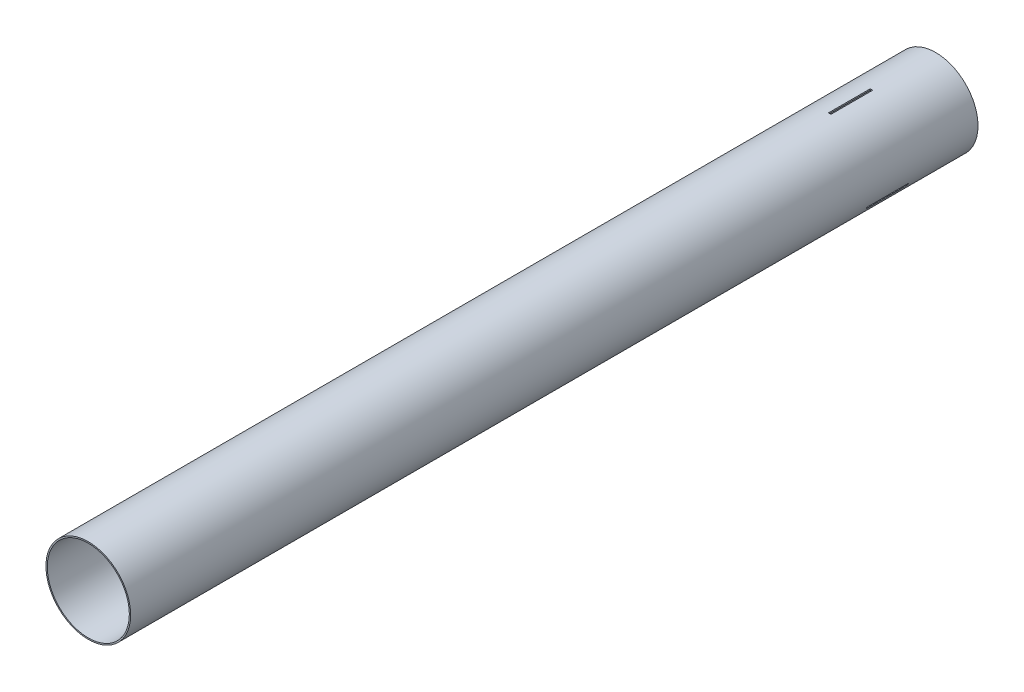
ISO-10303-21;
HEADER;
FILE_DESCRIPTION(('STEP AP214'),'2;1');
FILE_NAME('part.step','',(''),(''),'','','');
FILE_SCHEMA(('AUTOMOTIVE_DESIGN { 1 0 10303 214 1 1 1 1 }'));
ENDSEC;
DATA;
#1=APPLICATION_CONTEXT('core data for automotive mechanical design processes');
#2=APPLICATION_PROTOCOL_DEFINITION('international standard','automotive_design',2000,#1);
#3=PRODUCT_CONTEXT('',#1,'mechanical');
#4=PRODUCT('Part','Part','',(#3));
#5=PRODUCT_RELATED_PRODUCT_CATEGORY('part','',(#4));
#6=PRODUCT_DEFINITION_FORMATION('','',#4);
#7=PRODUCT_DEFINITION_CONTEXT('part definition',#1,'design');
#8=PRODUCT_DEFINITION('design','',#6,#7);
#9=PRODUCT_DEFINITION_SHAPE('','',#8);
#10=(LENGTH_UNIT() NAMED_UNIT(*) SI_UNIT(.MILLI.,.METRE.));
#11=(NAMED_UNIT(*) PLANE_ANGLE_UNIT() SI_UNIT($,.RADIAN.));
#12=(NAMED_UNIT(*) SI_UNIT($,.STERADIAN.) SOLID_ANGLE_UNIT());
#13=UNCERTAINTY_MEASURE_WITH_UNIT(LENGTH_MEASURE(1.E-05),#10,'distance_accuracy_value','');
#14=(GEOMETRIC_REPRESENTATION_CONTEXT(3) GLOBAL_UNCERTAINTY_ASSIGNED_CONTEXT((#13)) GLOBAL_UNIT_ASSIGNED_CONTEXT((#10,
#11,#12)) REPRESENTATION_CONTEXT('',''));
#15=CARTESIAN_POINT('',(0.,0.,0.));
#16=DIRECTION('',(0.,0.,1.));
#17=DIRECTION('',(1.,0.,0.));
#18=AXIS2_PLACEMENT_3D('',#15,#16,#17);
#19=CARTESIAN_POINT('',(0.,0.,1016.));
#20=DIRECTION('',(0.,0.,-1.));
#21=DIRECTION('',(-1.,0.,0.));
#22=AXIS2_PLACEMENT_3D('',#19,#20,#21);
#23=CYLINDRICAL_SURFACE('',#22,50.8);
#24=CARTESIAN_POINT('',(0.,0.,76.9874));
#25=DIRECTION('',(0.,0.,1.));
#26=DIRECTION('',(1.,0.,0.));
#27=AXIS2_PLACEMENT_3D('',#24,#25,#26);
#28=CIRCLE('',#27,50.8);
#29=CARTESIAN_POINT('',(43.2256434170204,-26.6867710895231,76.9874));
#30=VERTEX_POINT('',#29);
#31=CARTESIAN_POINT('',(44.7242434170202,-24.0911197493003,76.9874));
#32=VERTEX_POINT('',#31);
#33=EDGE_CURVE('E225',#30,#32,#28,.T.);
#34=ORIENTED_EDGE('',*,*,#33,.F.);
#35=DIRECTION('',(0.,0.,-1.));
#36=VECTOR('',#35,1.);
#37=CARTESIAN_POINT('',(43.2256434170204,-26.6867710895231,1016.));
#38=LINE('',#37,#36);
#39=CARTESIAN_POINT('',(43.2256434170204,-26.6867710895231,127.));
#40=VERTEX_POINT('',#39);
#41=EDGE_CURVE('E227',#30,#40,#38,.F.);
#42=ORIENTED_EDGE('',*,*,#41,.T.);
#43=CARTESIAN_POINT('',(0.,0.,127.));
#44=DIRECTION('',(0.,0.,1.));
#45=DIRECTION('',(1.,0.,0.));
#46=AXIS2_PLACEMENT_3D('',#43,#44,#45);
#47=CIRCLE('',#46,50.8);
#48=CARTESIAN_POINT('',(44.7242434170202,-24.0911197493003,127.));
#49=VERTEX_POINT('',#48);
#50=EDGE_CURVE('E222',#40,#49,#47,.T.);
#51=ORIENTED_EDGE('',*,*,#50,.T.);
#52=DIRECTION('',(0.,0.,-1.));
#53=VECTOR('',#52,1.);
#54=CARTESIAN_POINT('',(44.7242434170202,-24.0911197493003,1016.));
#55=LINE('',#54,#53);
#56=EDGE_CURVE('E230',#49,#32,#55,.T.);
#57=ORIENTED_EDGE('',*,*,#56,.T.);
#58=EDGE_LOOP('',(#34,#42,#51,#57));
#59=FACE_BOUND('',#58,.T.);
#60=CARTESIAN_POINT('',(0.,0.,0.));
#61=DIRECTION('',(0.,0.,1.));
#62=DIRECTION('',(1.,0.,0.));
#63=AXIS2_PLACEMENT_3D('',#60,#61,#62);
#64=CIRCLE('',#63,50.8);
#65=CARTESIAN_POINT('',(50.8,0.,0.));
#66=VERTEX_POINT('',#65);
#67=EDGE_CURVE('E244',#66,#66,#64,.T.);
#68=ORIENTED_EDGE('',*,*,#67,.T.);
#69=EDGE_LOOP('',(#68));
#70=FACE_BOUND('',#69,.T.);
#71=CARTESIAN_POINT('',(0.,0.,1016.));
#72=DIRECTION('',(0.,0.,1.));
#73=DIRECTION('',(1.,0.,0.));
#74=AXIS2_PLACEMENT_3D('',#71,#72,#73);
#75=CIRCLE('',#74,50.8);
#76=CARTESIAN_POINT('',(50.8,0.,1016.));
#77=VERTEX_POINT('',#76);
#78=EDGE_CURVE('E137',#77,#77,#75,.T.);
#79=ORIENTED_EDGE('',*,*,#78,.F.);
#80=EDGE_LOOP('',(#79));
#81=FACE_BOUND('',#80,.T.);
#82=CARTESIAN_POINT('',(0.,0.,76.9874));
#83=DIRECTION('',(0.,0.,1.));
#84=DIRECTION('',(1.,0.,0.));
#85=AXIS2_PLACEMENT_3D('',#82,#83,#84);
#86=CIRCLE('',#85,50.8);
#87=CARTESIAN_POINT('',(-44.8901667970468,-23.7805156574308,76.9874));
#88=VERTEX_POINT('',#87);
#89=CARTESIAN_POINT('',(-43.4095582596504,-26.3865543734308,76.9874));
#90=VERTEX_POINT('',#89);
#91=EDGE_CURVE('E196',#88,#90,#86,.T.);
#92=ORIENTED_EDGE('',*,*,#91,.F.);
#93=DIRECTION('',(0.,0.,-1.));
#94=VECTOR('',#93,1.);
#95=CARTESIAN_POINT('',(-44.8901667970468,-23.7805156574308,1016.));
#96=LINE('',#95,#94);
#97=CARTESIAN_POINT('',(-44.8901667970468,-23.7805156574308,127.));
#98=VERTEX_POINT('',#97);
#99=EDGE_CURVE('E218',#88,#98,#96,.F.);
#100=ORIENTED_EDGE('',*,*,#99,.T.);
#101=CARTESIAN_POINT('',(0.,0.,127.));
#102=DIRECTION('',(0.,0.,1.));
#103=DIRECTION('',(1.,0.,0.));
#104=AXIS2_PLACEMENT_3D('',#101,#102,#103);
#105=CIRCLE('',#104,50.8);
#106=CARTESIAN_POINT('',(-43.4095582596504,-26.3865543734308,127.));
#107=VERTEX_POINT('',#106);
#108=EDGE_CURVE('E194',#98,#107,#105,.T.);
#109=ORIENTED_EDGE('',*,*,#108,.T.);
#110=DIRECTION('',(0.,0.,-1.));
#111=VECTOR('',#110,1.);
#112=CARTESIAN_POINT('',(-43.4095582596504,-26.3865543734308,1016.));
#113=LINE('',#112,#111);
#114=EDGE_CURVE('E145',#107,#90,#113,.T.);
#115=ORIENTED_EDGE('',*,*,#114,.T.);
#116=EDGE_LOOP('',(#92,#100,#109,#115));
#117=FACE_BOUND('',#116,.T.);
#118=CARTESIAN_POINT('',(0.,0.,76.9874));
#119=DIRECTION('',(0.,0.,1.));
#120=DIRECTION('',(1.,0.,0.));
#121=AXIS2_PLACEMENT_3D('',#118,#119,#120);
#122=CIRCLE('',#121,50.8);
#123=CARTESIAN_POINT('',(1.4986,50.7778908388287,76.9874));
#124=VERTEX_POINT('',#123);
#125=CARTESIAN_POINT('',(-1.4986,50.7778908388287,76.9874));
#126=VERTEX_POINT('',#125);
#127=EDGE_CURVE('E184',#124,#126,#122,.T.);
#128=ORIENTED_EDGE('',*,*,#127,.F.);
#129=DIRECTION('',(0.,0.,-1.));
#130=VECTOR('',#129,1.);
#131=CARTESIAN_POINT('',(1.4986,50.7778908388287,1016.));
#132=LINE('',#131,#130);
#133=CARTESIAN_POINT('',(1.4986,50.7778908388287,127.));
#134=VERTEX_POINT('',#133);
#135=EDGE_CURVE('E193',#124,#134,#132,.F.);
#136=ORIENTED_EDGE('',*,*,#135,.T.);
#137=CARTESIAN_POINT('',(0.,0.,127.));
#138=DIRECTION('',(0.,0.,1.));
#139=DIRECTION('',(1.,0.,0.));
#140=AXIS2_PLACEMENT_3D('',#137,#138,#139);
#141=CIRCLE('',#140,50.8);
#142=CARTESIAN_POINT('',(-1.4986,50.7778908388287,127.));
#143=VERTEX_POINT('',#142);
#144=EDGE_CURVE('E233',#134,#143,#141,.T.);
#145=ORIENTED_EDGE('',*,*,#144,.T.);
#146=DIRECTION('',(0.,0.,-1.));
#147=VECTOR('',#146,1.);
#148=CARTESIAN_POINT('',(-1.4986,50.7778908388287,1016.));
#149=LINE('',#148,#147);
#150=EDGE_CURVE('E238',#143,#126,#149,.T.);
#151=ORIENTED_EDGE('',*,*,#150,.T.);
#152=EDGE_LOOP('',(#128,#136,#145,#151));
#153=FACE_BOUND('',#152,.T.);
#154=ADVANCED_FACE('F38',(#59,#70,#81,#117,#153),#23,.T.);
#155=CARTESIAN_POINT('',(0.,0.,1016.));
#156=DIRECTION('',(0.,0.,-1.));
#157=DIRECTION('',(-1.,0.,0.));
#158=AXIS2_PLACEMENT_3D('',#155,#156,#157);
#159=CYLINDRICAL_SURFACE('',#158,49.2125);
#160=CARTESIAN_POINT('',(0.,0.,1016.));
#161=DIRECTION('',(0.,0.,1.));
#162=DIRECTION('',(1.,0.,0.));
#163=AXIS2_PLACEMENT_3D('',#160,#161,#162);
#164=CIRCLE('',#163,49.2125);
#165=CARTESIAN_POINT('',(49.2125,0.,1016.));
#166=VERTEX_POINT('',#165);
#167=EDGE_CURVE('E241',#166,#166,#164,.T.);
#168=ORIENTED_EDGE('',*,*,#167,.T.);
#169=EDGE_LOOP('',(#168));
#170=FACE_BOUND('',#169,.T.);
#171=CARTESIAN_POINT('',(0.,0.,0.));
#172=DIRECTION('',(0.,0.,1.));
#173=DIRECTION('',(1.,0.,0.));
#174=AXIS2_PLACEMENT_3D('',#171,#172,#173);
#175=CIRCLE('',#174,49.2125);
#176=CARTESIAN_POINT('',(49.2125,0.,0.));
#177=VERTEX_POINT('',#176);
#178=EDGE_CURVE('E240',#177,#177,#175,.T.);
#179=ORIENTED_EDGE('',*,*,#178,.F.);
#180=EDGE_LOOP('',(#179));
#181=FACE_BOUND('',#180,.T.);
#182=DIRECTION('',(0.,0.,-1.));
#183=VECTOR('',#182,1.);
#184=CARTESIAN_POINT('',(-43.5144088743328,-22.9862214504121,1016.));
#185=LINE('',#184,#183);
#186=CARTESIAN_POINT('',(-43.5144088743328,-22.9862214504121,76.9874));
#187=VERTEX_POINT('',#186);
#188=CARTESIAN_POINT('',(-43.5144088743328,-22.9862214504121,127.));
#189=VERTEX_POINT('',#188);
#190=EDGE_CURVE('E136',#187,#189,#185,.F.);
#191=ORIENTED_EDGE('',*,*,#190,.F.);
#192=CARTESIAN_POINT('',(0.,0.,76.9874));
#193=DIRECTION('',(0.,0.,1.));
#194=DIRECTION('',(1.,0.,0.));
#195=AXIS2_PLACEMENT_3D('',#192,#193,#194);
#196=CIRCLE('',#195,49.2125);
#197=CARTESIAN_POINT('',(-42.0343812662779,-25.5925955661239,76.9874));
#198=VERTEX_POINT('',#197);
#199=EDGE_CURVE('E151',#187,#198,#196,.T.);
#200=ORIENTED_EDGE('',*,*,#199,.T.);
#201=DIRECTION('',(0.,0.,-1.));
#202=VECTOR('',#201,1.);
#203=CARTESIAN_POINT('',(-42.0343812662779,-25.5925955661239,1016.));
#204=LINE('',#203,#202);
#205=CARTESIAN_POINT('',(-42.0343812662779,-25.5925955661239,127.));
#206=VERTEX_POINT('',#205);
#207=EDGE_CURVE('E142',#206,#198,#204,.T.);
#208=ORIENTED_EDGE('',*,*,#207,.F.);
#209=CARTESIAN_POINT('',(0.,0.,127.));
#210=DIRECTION('',(0.,0.,1.));
#211=DIRECTION('',(1.,0.,0.));
#212=AXIS2_PLACEMENT_3D('',#209,#210,#211);
#213=CIRCLE('',#212,49.2125);
#214=EDGE_CURVE('E125',#189,#206,#213,.T.);
#215=ORIENTED_EDGE('',*,*,#214,.F.);
#216=EDGE_LOOP('',(#191,#200,#208,#215));
#217=FACE_BOUND('',#216,.T.);
#218=DIRECTION('',(0.,0.,-1.));
#219=VECTOR('',#218,1.);
#220=CARTESIAN_POINT('',(41.8502101581889,-25.8926643272844,1016.));
#221=LINE('',#220,#219);
#222=CARTESIAN_POINT('',(41.8502101581889,-25.8926643272844,76.9874));
#223=VERTEX_POINT('',#222);
#224=CARTESIAN_POINT('',(41.8502101581889,-25.8926643272844,127.));
#225=VERTEX_POINT('',#224);
#226=EDGE_CURVE('E158',#223,#225,#221,.F.);
#227=ORIENTED_EDGE('',*,*,#226,.F.);
#228=CARTESIAN_POINT('',(0.,0.,76.9874));
#229=DIRECTION('',(0.,0.,1.));
#230=DIRECTION('',(1.,0.,0.));
#231=AXIS2_PLACEMENT_3D('',#228,#229,#230);
#232=CIRCLE('',#231,49.2125);
#233=CARTESIAN_POINT('',(43.3488101581887,-23.2970129870615,76.9874));
#234=VERTEX_POINT('',#233);
#235=EDGE_CURVE('E163',#223,#234,#232,.T.);
#236=ORIENTED_EDGE('',*,*,#235,.T.);
#237=DIRECTION('',(0.,0.,-1.));
#238=VECTOR('',#237,1.);
#239=CARTESIAN_POINT('',(43.3488101581887,-23.2970129870615,1016.));
#240=LINE('',#239,#238);
#241=CARTESIAN_POINT('',(43.3488101581887,-23.2970129870615,127.));
#242=VERTEX_POINT('',#241);
#243=EDGE_CURVE('E161',#242,#234,#240,.T.);
#244=ORIENTED_EDGE('',*,*,#243,.F.);
#245=CARTESIAN_POINT('',(0.,0.,127.));
#246=DIRECTION('',(0.,0.,1.));
#247=DIRECTION('',(1.,0.,0.));
#248=AXIS2_PLACEMENT_3D('',#245,#246,#247);
#249=CIRCLE('',#248,49.2125);
#250=EDGE_CURVE('E153',#225,#242,#249,.T.);
#251=ORIENTED_EDGE('',*,*,#250,.F.);
#252=EDGE_LOOP('',(#227,#236,#244,#251));
#253=FACE_BOUND('',#252,.T.);
#254=DIRECTION('',(0.,0.,-1.));
#255=VECTOR('',#254,1.);
#256=CARTESIAN_POINT('',(1.4986,49.1896773143512,1016.));
#257=LINE('',#256,#255);
#258=CARTESIAN_POINT('',(1.4986,49.1896773143512,76.9874));
#259=VERTEX_POINT('',#258);
#260=CARTESIAN_POINT('',(1.4986,49.1896773143512,127.));
#261=VERTEX_POINT('',#260);
#262=EDGE_CURVE('E168',#259,#261,#257,.F.);
#263=ORIENTED_EDGE('',*,*,#262,.F.);
#264=CARTESIAN_POINT('',(0.,0.,76.9874));
#265=DIRECTION('',(0.,0.,1.));
#266=DIRECTION('',(1.,0.,0.));
#267=AXIS2_PLACEMENT_3D('',#264,#265,#266);
#268=CIRCLE('',#267,49.2125);
#269=CARTESIAN_POINT('',(-1.4986,49.1896773143512,76.9874));
#270=VERTEX_POINT('',#269);
#271=EDGE_CURVE('E11',#259,#270,#268,.T.);
#272=ORIENTED_EDGE('',*,*,#271,.T.);
#273=DIRECTION('',(0.,0.,-1.));
#274=VECTOR('',#273,1.);
#275=CARTESIAN_POINT('',(-1.4986,49.1896773143512,1016.));
#276=LINE('',#275,#274);
#277=CARTESIAN_POINT('',(-1.4986,49.1896773143512,127.));
#278=VERTEX_POINT('',#277);
#279=EDGE_CURVE('E45',#278,#270,#276,.T.);
#280=ORIENTED_EDGE('',*,*,#279,.F.);
#281=CARTESIAN_POINT('',(0.,0.,127.));
#282=DIRECTION('',(0.,0.,1.));
#283=DIRECTION('',(1.,0.,0.));
#284=AXIS2_PLACEMENT_3D('',#281,#282,#283);
#285=CIRCLE('',#284,49.2125);
#286=EDGE_CURVE('E166',#261,#278,#285,.T.);
#287=ORIENTED_EDGE('',*,*,#286,.F.);
#288=EDGE_LOOP('',(#263,#272,#280,#287));
#289=FACE_BOUND('',#288,.T.);
#290=ADVANCED_FACE('F149',(#170,#181,#217,#253,#289),#159,.F.);
#291=CARTESIAN_POINT('',(0.,0.,1016.));
#292=DIRECTION('',(0.,0.,1.));
#293=DIRECTION('',(1.,0.,0.));
#294=AXIS2_PLACEMENT_3D('',#291,#292,#293);
#295=PLANE('',#294);
#296=ORIENTED_EDGE('',*,*,#78,.T.);
#297=EDGE_LOOP('',(#296));
#298=FACE_BOUND('',#297,.T.);
#299=ORIENTED_EDGE('',*,*,#167,.F.);
#300=EDGE_LOOP('',(#299));
#301=FACE_BOUND('',#300,.T.);
#302=ADVANCED_FACE('F257',(#298,#301),#295,.T.);
#303=CARTESIAN_POINT('',(0.,0.,0.));
#304=DIRECTION('',(0.,0.,1.));
#305=DIRECTION('',(1.,0.,0.));
#306=AXIS2_PLACEMENT_3D('',#303,#304,#305);
#307=PLANE('',#306);
#308=ORIENTED_EDGE('',*,*,#67,.F.);
#309=EDGE_LOOP('',(#308));
#310=FACE_BOUND('',#309,.T.);
#311=ORIENTED_EDGE('',*,*,#178,.T.);
#312=EDGE_LOOP('',(#311));
#313=FACE_BOUND('',#312,.T.);
#314=ADVANCED_FACE('F254',(#310,#313),#307,.F.);
#315=CARTESIAN_POINT('',(-25.3721912416451,-15.9726756701134,76.9874));
#316=DIRECTION('',(0.5,-0.866025403784439,0.));
#317=DIRECTION('',(0.866025403784439,0.5,0.));
#318=AXIS2_PLACEMENT_3D('',#315,#316,#317);
#319=PLANE('',#318);
#320=DIRECTION('',(0.866025403784438,0.5,0.));
#321=VECTOR('',#320,1.);
#322=CARTESIAN_POINT('',(-25.3721912416451,-15.9726756701134,127.));
#323=LINE('',#322,#321);
#324=EDGE_CURVE('E128',#107,#206,#323,.T.);
#325=ORIENTED_EDGE('',*,*,#324,.T.);
#326=ORIENTED_EDGE('',*,*,#207,.T.);
#327=DIRECTION('',(0.866025403784438,0.5,0.));
#328=VECTOR('',#327,1.);
#329=CARTESIAN_POINT('',(-25.3721912416451,-15.9726756701134,76.9874));
#330=LINE('',#329,#328);
#331=EDGE_CURVE('E212',#90,#198,#330,.T.);
#332=ORIENTED_EDGE('',*,*,#331,.F.);
#333=ORIENTED_EDGE('',*,*,#114,.F.);
#334=EDGE_LOOP('',(#325,#326,#332,#333));
#335=FACE_BOUND('',#334,.T.);
#336=ADVANCED_FACE('F140',(#335),#319,.F.);
#337=CARTESIAN_POINT('',(-26.8707912416451,-13.3770243298907,76.9874));
#338=DIRECTION('',(-0.5,0.866025403784439,0.));
#339=DIRECTION('',(-0.866025403784439,-0.5,0.));
#340=AXIS2_PLACEMENT_3D('',#337,#338,#339);
#341=PLANE('',#340);
#342=DIRECTION('',(-0.866025403784438,-0.5,0.));
#343=VECTOR('',#342,1.);
#344=CARTESIAN_POINT('',(-26.8707912416451,-13.3770243298907,76.9874));
#345=LINE('',#344,#343);
#346=EDGE_CURVE('E209',#187,#88,#345,.T.);
#347=ORIENTED_EDGE('',*,*,#346,.F.);
#348=ORIENTED_EDGE('',*,*,#190,.T.);
#349=DIRECTION('',(-0.866025403784438,-0.5,0.));
#350=VECTOR('',#349,1.);
#351=CARTESIAN_POINT('',(-26.8707912416451,-13.3770243298907,127.));
#352=LINE('',#351,#350);
#353=EDGE_CURVE('E131',#189,#98,#352,.T.);
#354=ORIENTED_EDGE('',*,*,#353,.T.);
#355=ORIENTED_EDGE('',*,*,#99,.F.);
#356=EDGE_LOOP('',(#347,#348,#354,#355));
#357=FACE_BOUND('',#356,.T.);
#358=ADVANCED_FACE('F273',(#357),#341,.F.);
#359=CARTESIAN_POINT('',(0.,0.,76.9874));
#360=DIRECTION('',(0.,0.,1.));
#361=DIRECTION('',(1.,0.,0.));
#362=AXIS2_PLACEMENT_3D('',#359,#360,#361);
#363=PLANE('',#362);
#364=ORIENTED_EDGE('',*,*,#91,.T.);
#365=ORIENTED_EDGE('',*,*,#331,.T.);
#366=ORIENTED_EDGE('',*,*,#199,.F.);
#367=ORIENTED_EDGE('',*,*,#346,.T.);
#368=EDGE_LOOP('',(#364,#365,#366,#367));
#369=FACE_BOUND('',#368,.T.);
#370=ADVANCED_FACE('F276',(#369),#363,.T.);
#371=CARTESIAN_POINT('',(0.,0.,127.));
#372=DIRECTION('',(0.,0.,1.));
#373=DIRECTION('',(1.,0.,0.));
#374=AXIS2_PLACEMENT_3D('',#371,#372,#373);
#375=PLANE('',#374);
#376=ORIENTED_EDGE('',*,*,#353,.F.);
#377=ORIENTED_EDGE('',*,*,#214,.T.);
#378=ORIENTED_EDGE('',*,*,#324,.F.);
#379=ORIENTED_EDGE('',*,*,#108,.F.);
#380=EDGE_LOOP('',(#376,#377,#378,#379));
#381=FACE_BOUND('',#380,.T.);
#382=ADVANCED_FACE('F127',(#381),#375,.F.);
#383=CARTESIAN_POINT('',(26.5188385175534,-13.580224329887,76.9874));
#384=DIRECTION('',(0.5,0.866025403784439,0.));
#385=DIRECTION('',(-0.866025403784439,0.5,0.));
#386=AXIS2_PLACEMENT_3D('',#383,#384,#385);
#387=PLANE('',#386);
#388=DIRECTION('',(-0.866025403784439,0.5,0.));
#389=VECTOR('',#388,1.);
#390=CARTESIAN_POINT('',(26.5188385175534,-13.580224329887,127.));
#391=LINE('',#390,#389);
#392=EDGE_CURVE('E60',#49,#242,#391,.T.);
#393=ORIENTED_EDGE('',*,*,#392,.T.);
#394=ORIENTED_EDGE('',*,*,#243,.T.);
#395=DIRECTION('',(-0.866025403784439,0.5,0.));
#396=VECTOR('',#395,1.);
#397=CARTESIAN_POINT('',(26.5188385175534,-13.580224329887,76.9874));
#398=LINE('',#397,#396);
#399=EDGE_CURVE('E202',#32,#234,#398,.T.);
#400=ORIENTED_EDGE('',*,*,#399,.F.);
#401=ORIENTED_EDGE('',*,*,#56,.F.);
#402=EDGE_LOOP('',(#393,#394,#400,#401));
#403=FACE_BOUND('',#402,.T.);
#404=ADVANCED_FACE('F280',(#403),#387,.F.);
#405=CARTESIAN_POINT('',(25.0202385175534,-16.1758756701097,76.9874));
#406=DIRECTION('',(-0.5,-0.866025403784439,0.));
#407=DIRECTION('',(0.866025403784439,-0.5,0.));
#408=AXIS2_PLACEMENT_3D('',#405,#406,#407);
#409=PLANE('',#408);
#410=DIRECTION('',(0.866025403784439,-0.5,0.));
#411=VECTOR('',#410,1.);
#412=CARTESIAN_POINT('',(25.0202385175534,-16.1758756701097,76.9874));
#413=LINE('',#412,#411);
#414=EDGE_CURVE('E200',#223,#30,#413,.T.);
#415=ORIENTED_EDGE('',*,*,#414,.F.);
#416=ORIENTED_EDGE('',*,*,#226,.T.);
#417=DIRECTION('',(0.866025403784439,-0.5,0.));
#418=VECTOR('',#417,1.);
#419=CARTESIAN_POINT('',(25.0202385175534,-16.1758756701097,127.));
#420=LINE('',#419,#418);
#421=EDGE_CURVE('E205',#225,#40,#420,.T.);
#422=ORIENTED_EDGE('',*,*,#421,.T.);
#423=ORIENTED_EDGE('',*,*,#41,.F.);
#424=EDGE_LOOP('',(#415,#416,#422,#423));
#425=FACE_BOUND('',#424,.T.);
#426=ADVANCED_FACE('F286',(#425),#409,.F.);
#427=CARTESIAN_POINT('',(0.,0.,76.9874));
#428=DIRECTION('',(0.,0.,1.));
#429=DIRECTION('',(1.,0.,0.));
#430=AXIS2_PLACEMENT_3D('',#427,#428,#429);
#431=PLANE('',#430);
#432=ORIENTED_EDGE('',*,*,#33,.T.);
#433=ORIENTED_EDGE('',*,*,#399,.T.);
#434=ORIENTED_EDGE('',*,*,#235,.F.);
#435=ORIENTED_EDGE('',*,*,#414,.T.);
#436=EDGE_LOOP('',(#432,#433,#434,#435));
#437=FACE_BOUND('',#436,.T.);
#438=ADVANCED_FACE('F290',(#437),#431,.T.);
#439=CARTESIAN_POINT('',(0.,0.,127.));
#440=DIRECTION('',(0.,0.,1.));
#441=DIRECTION('',(1.,0.,0.));
#442=AXIS2_PLACEMENT_3D('',#439,#440,#441);
#443=PLANE('',#442);
#444=ORIENTED_EDGE('',*,*,#421,.F.);
#445=ORIENTED_EDGE('',*,*,#250,.T.);
#446=ORIENTED_EDGE('',*,*,#392,.F.);
#447=ORIENTED_EDGE('',*,*,#50,.F.);
#448=EDGE_LOOP('',(#444,#445,#446,#447));
#449=FACE_BOUND('',#448,.T.);
#450=ADVANCED_FACE('F292',(#449),#443,.F.);
#451=CARTESIAN_POINT('',(-1.4986,30.1625,76.9874));
#452=DIRECTION('',(-1.,0.,0.));
#453=DIRECTION('',(0.,0.,1.));
#454=AXIS2_PLACEMENT_3D('',#451,#452,#453);
#455=PLANE('',#454);
#456=DIRECTION('',(0.,-1.,0.));
#457=VECTOR('',#456,1.);
#458=CARTESIAN_POINT('',(-1.4986,30.1625,127.));
#459=LINE('',#458,#457);
#460=EDGE_CURVE('E52',#143,#278,#459,.T.);
#461=ORIENTED_EDGE('',*,*,#460,.T.);
#462=ORIENTED_EDGE('',*,*,#279,.T.);
#463=DIRECTION('',(0.,-1.,0.));
#464=VECTOR('',#463,1.);
#465=CARTESIAN_POINT('',(-1.4986,30.1625,76.9874));
#466=LINE('',#465,#464);
#467=EDGE_CURVE('E175',#126,#270,#466,.T.);
#468=ORIENTED_EDGE('',*,*,#467,.F.);
#469=ORIENTED_EDGE('',*,*,#150,.F.);
#470=EDGE_LOOP('',(#461,#462,#468,#469));
#471=FACE_BOUND('',#470,.T.);
#472=ADVANCED_FACE('F174',(#471),#455,.F.);
#473=CARTESIAN_POINT('',(1.4986,30.1625,76.9874));
#474=DIRECTION('',(1.,0.,0.));
#475=DIRECTION('',(0.,0.,-1.));
#476=AXIS2_PLACEMENT_3D('',#473,#474,#475);
#477=PLANE('',#476);
#478=DIRECTION('',(0.,1.,0.));
#479=VECTOR('',#478,1.);
#480=CARTESIAN_POINT('',(1.4986,30.1625,76.9874));
#481=LINE('',#480,#479);
#482=EDGE_CURVE('E185',#259,#124,#481,.T.);
#483=ORIENTED_EDGE('',*,*,#482,.F.);
#484=ORIENTED_EDGE('',*,*,#262,.T.);
#485=DIRECTION('',(0.,1.,0.));
#486=VECTOR('',#485,1.);
#487=CARTESIAN_POINT('',(1.4986,30.1625,127.));
#488=LINE('',#487,#486);
#489=EDGE_CURVE('E186',#261,#134,#488,.T.);
#490=ORIENTED_EDGE('',*,*,#489,.T.);
#491=ORIENTED_EDGE('',*,*,#135,.F.);
#492=EDGE_LOOP('',(#483,#484,#490,#491));
#493=FACE_BOUND('',#492,.T.);
#494=ADVANCED_FACE('F191',(#493),#477,.F.);
#495=CARTESIAN_POINT('',(0.,0.,76.9874));
#496=DIRECTION('',(0.,0.,1.));
#497=DIRECTION('',(1.,0.,0.));
#498=AXIS2_PLACEMENT_3D('',#495,#496,#497);
#499=PLANE('',#498);
#500=ORIENTED_EDGE('',*,*,#127,.T.);
#501=ORIENTED_EDGE('',*,*,#467,.T.);
#502=ORIENTED_EDGE('',*,*,#271,.F.);
#503=ORIENTED_EDGE('',*,*,#482,.T.);
#504=EDGE_LOOP('',(#500,#501,#502,#503));
#505=FACE_BOUND('',#504,.T.);
#506=ADVANCED_FACE('F180',(#505),#499,.T.);
#507=CARTESIAN_POINT('',(0.,0.,127.));
#508=DIRECTION('',(0.,0.,1.));
#509=DIRECTION('',(1.,0.,0.));
#510=AXIS2_PLACEMENT_3D('',#507,#508,#509);
#511=PLANE('',#510);
#512=ORIENTED_EDGE('',*,*,#489,.F.);
#513=ORIENTED_EDGE('',*,*,#286,.T.);
#514=ORIENTED_EDGE('',*,*,#460,.F.);
#515=ORIENTED_EDGE('',*,*,#144,.F.);
#516=EDGE_LOOP('',(#512,#513,#514,#515));
#517=FACE_BOUND('',#516,.T.);
#518=ADVANCED_FACE('F302',(#517),#511,.F.);
#519=CLOSED_SHELL('',(#154,#290,#302,#314,#336,#358,#370,#382,#404,#426,#438,#450,#472,#494,
#506,#518));
#520=MANIFOLD_SOLID_BREP('B2',#519);
#521=ADVANCED_BREP_SHAPE_REPRESENTATION('',(#18,#520),#14);
#522=SHAPE_DEFINITION_REPRESENTATION(#9,#521);
ENDSEC;
END-ISO-10303-21;
